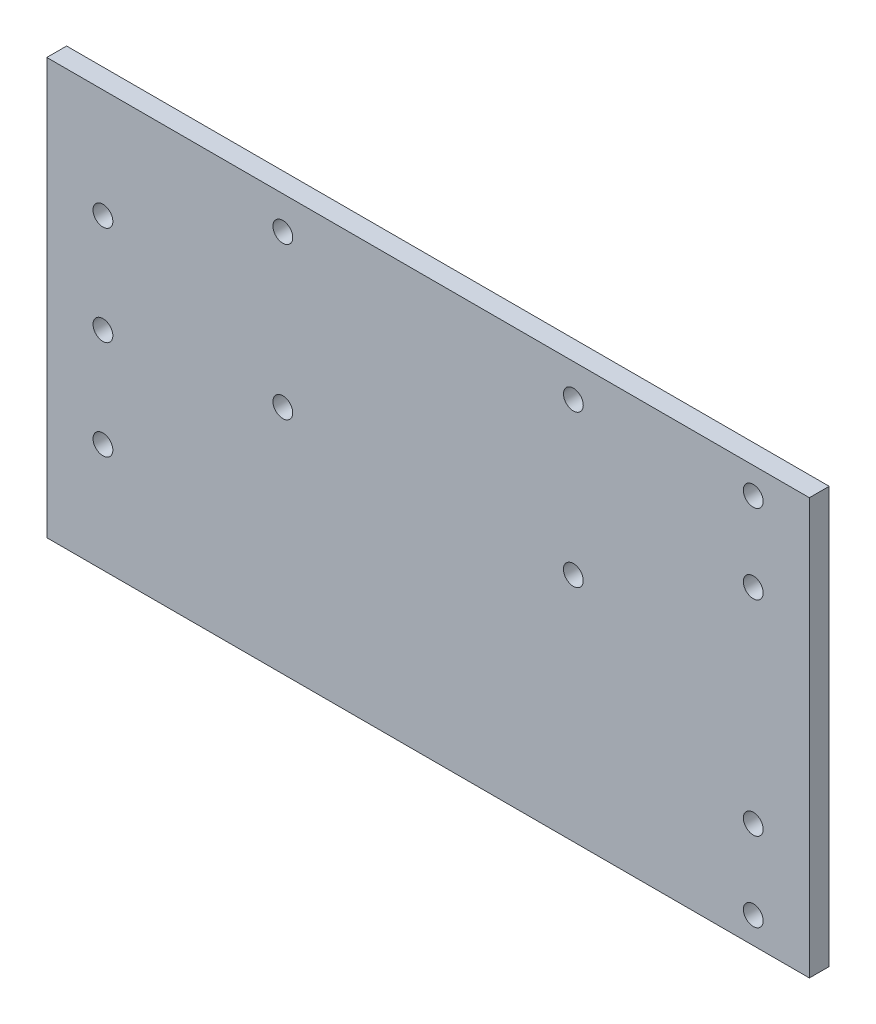
ISO-10303-21;
HEADER;
FILE_DESCRIPTION(('STEP AP214'),'2;1');
FILE_NAME('part.step','',(''),(''),'','','');
FILE_SCHEMA(('AUTOMOTIVE_DESIGN { 1 0 10303 214 1 1 1 1 }'));
ENDSEC;
DATA;
#1=APPLICATION_CONTEXT('core data for automotive mechanical design processes');
#2=APPLICATION_PROTOCOL_DEFINITION('international standard','automotive_design',2000,#1);
#3=PRODUCT_CONTEXT('',#1,'mechanical');
#4=PRODUCT('Part','Part','',(#3));
#5=PRODUCT_RELATED_PRODUCT_CATEGORY('part','',(#4));
#6=PRODUCT_DEFINITION_FORMATION('','',#4);
#7=PRODUCT_DEFINITION_CONTEXT('part definition',#1,'design');
#8=PRODUCT_DEFINITION('design','',#6,#7);
#9=PRODUCT_DEFINITION_SHAPE('','',#8);
#10=(LENGTH_UNIT() NAMED_UNIT(*) SI_UNIT(.MILLI.,.METRE.));
#11=(NAMED_UNIT(*) PLANE_ANGLE_UNIT() SI_UNIT($,.RADIAN.));
#12=(NAMED_UNIT(*) SI_UNIT($,.STERADIAN.) SOLID_ANGLE_UNIT());
#13=UNCERTAINTY_MEASURE_WITH_UNIT(LENGTH_MEASURE(1.E-05),#10,'distance_accuracy_value','');
#14=(GEOMETRIC_REPRESENTATION_CONTEXT(3) GLOBAL_UNCERTAINTY_ASSIGNED_CONTEXT((#13)) GLOBAL_UNIT_ASSIGNED_CONTEXT((#10,
#11,#12)) REPRESENTATION_CONTEXT('',''));
#15=CARTESIAN_POINT('',(0.,0.,0.));
#16=DIRECTION('',(0.,0.,1.));
#17=DIRECTION('',(1.,0.,0.));
#18=AXIS2_PLACEMENT_3D('',#15,#16,#17);
#19=CARTESIAN_POINT('',(57.75,31.5,3.));
#20=DIRECTION('',(-1.,0.,0.));
#21=DIRECTION('',(0.,-1.,0.));
#22=AXIS2_PLACEMENT_3D('',#19,#20,#21);
#23=PLANE('',#22);
#24=DIRECTION('',(0.,1.,0.));
#25=VECTOR('',#24,1.);
#26=CARTESIAN_POINT('',(57.75,31.5,0.));
#27=LINE('',#26,#25);
#28=CARTESIAN_POINT('',(57.75,-31.5,0.));
#29=VERTEX_POINT('',#28);
#30=CARTESIAN_POINT('',(57.75,31.5,0.));
#31=VERTEX_POINT('',#30);
#32=EDGE_CURVE('E107',#29,#31,#27,.T.);
#33=ORIENTED_EDGE('',*,*,#32,.T.);
#34=DIRECTION('',(0.,0.,-1.));
#35=VECTOR('',#34,1.);
#36=CARTESIAN_POINT('',(57.75,31.5,3.));
#37=LINE('',#36,#35);
#38=CARTESIAN_POINT('',(57.75,31.5,3.));
#39=VERTEX_POINT('',#38);
#40=EDGE_CURVE('E11',#39,#31,#37,.T.);
#41=ORIENTED_EDGE('',*,*,#40,.F.);
#42=DIRECTION('',(0.,1.,0.));
#43=VECTOR('',#42,1.);
#44=CARTESIAN_POINT('',(57.75,31.5,3.));
#45=LINE('',#44,#43);
#46=CARTESIAN_POINT('',(57.75,-31.5,3.));
#47=VERTEX_POINT('',#46);
#48=EDGE_CURVE('E91',#47,#39,#45,.T.);
#49=ORIENTED_EDGE('',*,*,#48,.F.);
#50=DIRECTION('',(0.,0.,-1.));
#51=VECTOR('',#50,1.);
#52=CARTESIAN_POINT('',(57.75,-31.5,3.));
#53=LINE('',#52,#51);
#54=EDGE_CURVE('E103',#47,#29,#53,.T.);
#55=ORIENTED_EDGE('',*,*,#54,.T.);
#56=EDGE_LOOP('',(#33,#41,#49,#55));
#57=FACE_BOUND('',#56,.T.);
#58=ADVANCED_FACE('F39',(#57),#23,.F.);
#59=CARTESIAN_POINT('',(-57.75,31.5,3.));
#60=DIRECTION('',(0.,-1.,0.));
#61=DIRECTION('',(0.,0.,-1.));
#62=AXIS2_PLACEMENT_3D('',#59,#60,#61);
#63=PLANE('',#62);
#64=DIRECTION('',(-1.,0.,0.));
#65=VECTOR('',#64,1.);
#66=CARTESIAN_POINT('',(-57.75,31.5,0.));
#67=LINE('',#66,#65);
#68=CARTESIAN_POINT('',(-57.75,31.5,0.));
#69=VERTEX_POINT('',#68);
#70=EDGE_CURVE('E96',#31,#69,#67,.T.);
#71=ORIENTED_EDGE('',*,*,#70,.T.);
#72=DIRECTION('',(0.,0.,-1.));
#73=VECTOR('',#72,1.);
#74=CARTESIAN_POINT('',(-57.75,31.5,3.));
#75=LINE('',#74,#73);
#76=CARTESIAN_POINT('',(-57.75,31.5,3.));
#77=VERTEX_POINT('',#76);
#78=EDGE_CURVE('E48',#77,#69,#75,.T.);
#79=ORIENTED_EDGE('',*,*,#78,.F.);
#80=DIRECTION('',(-1.,0.,0.));
#81=VECTOR('',#80,1.);
#82=CARTESIAN_POINT('',(-57.75,31.5,3.));
#83=LINE('',#82,#81);
#84=EDGE_CURVE('E86',#39,#77,#83,.T.);
#85=ORIENTED_EDGE('',*,*,#84,.F.);
#86=ORIENTED_EDGE('',*,*,#40,.T.);
#87=EDGE_LOOP('',(#71,#79,#85,#86));
#88=FACE_BOUND('',#87,.T.);
#89=ADVANCED_FACE('F95',(#88),#63,.F.);
#90=CARTESIAN_POINT('',(-57.75,31.5,3.));
#91=DIRECTION('',(1.,0.,0.));
#92=DIRECTION('',(0.,1.,0.));
#93=AXIS2_PLACEMENT_3D('',#90,#91,#92);
#94=PLANE('',#93);
#95=DIRECTION('',(0.,-1.,0.));
#96=VECTOR('',#95,1.);
#97=CARTESIAN_POINT('',(-57.75,31.5,0.));
#98=LINE('',#97,#96);
#99=CARTESIAN_POINT('',(-57.75,-31.5,0.));
#100=VERTEX_POINT('',#99);
#101=EDGE_CURVE('E73',#69,#100,#98,.T.);
#102=ORIENTED_EDGE('',*,*,#101,.T.);
#103=DIRECTION('',(0.,0.,-1.));
#104=VECTOR('',#103,1.);
#105=CARTESIAN_POINT('',(-57.75,-31.5,3.));
#106=LINE('',#105,#104);
#107=CARTESIAN_POINT('',(-57.75,-31.5,3.));
#108=VERTEX_POINT('',#107);
#109=EDGE_CURVE('E98',#108,#100,#106,.T.);
#110=ORIENTED_EDGE('',*,*,#109,.F.);
#111=DIRECTION('',(0.,-1.,0.));
#112=VECTOR('',#111,1.);
#113=CARTESIAN_POINT('',(-57.75,31.5,3.));
#114=LINE('',#113,#112);
#115=EDGE_CURVE('E89',#77,#108,#114,.T.);
#116=ORIENTED_EDGE('',*,*,#115,.F.);
#117=ORIENTED_EDGE('',*,*,#78,.T.);
#118=EDGE_LOOP('',(#102,#110,#116,#117));
#119=FACE_BOUND('',#118,.T.);
#120=ADVANCED_FACE('F99',(#119),#94,.F.);
#121=CARTESIAN_POINT('',(-57.75,-31.5,3.));
#122=DIRECTION('',(0.,1.,0.));
#123=DIRECTION('',(0.,0.,1.));
#124=AXIS2_PLACEMENT_3D('',#121,#122,#123);
#125=PLANE('',#124);
#126=DIRECTION('',(1.,0.,0.));
#127=VECTOR('',#126,1.);
#128=CARTESIAN_POINT('',(-57.75,-31.5,0.));
#129=LINE('',#128,#127);
#130=EDGE_CURVE('E79',#100,#29,#129,.T.);
#131=ORIENTED_EDGE('',*,*,#130,.T.);
#132=ORIENTED_EDGE('',*,*,#54,.F.);
#133=DIRECTION('',(1.,0.,0.));
#134=VECTOR('',#133,1.);
#135=CARTESIAN_POINT('',(-57.75,-31.5,3.));
#136=LINE('',#135,#134);
#137=EDGE_CURVE('E56',#108,#47,#136,.T.);
#138=ORIENTED_EDGE('',*,*,#137,.F.);
#139=ORIENTED_EDGE('',*,*,#109,.T.);
#140=EDGE_LOOP('',(#131,#132,#138,#139));
#141=FACE_BOUND('',#140,.T.);
#142=ADVANCED_FACE('F121',(#141),#125,.F.);
#143=CARTESIAN_POINT('',(0.,0.,3.));
#144=DIRECTION('',(0.,0.,1.));
#145=DIRECTION('',(1.,0.,0.));
#146=AXIS2_PLACEMENT_3D('',#143,#144,#145);
#147=PLANE('',#146);
#148=CARTESIAN_POINT('',(-22.,3.5,3.));
#149=DIRECTION('',(0.,0.,1.));
#150=DIRECTION('',(1.,0.,0.));
#151=AXIS2_PLACEMENT_3D('',#148,#149,#150);
#152=CIRCLE('',#151,1.5);
#153=CARTESIAN_POINT('',(-20.5,3.5,3.));
#154=VERTEX_POINT('',#153);
#155=EDGE_CURVE('E192',#154,#154,#152,.T.);
#156=ORIENTED_EDGE('',*,*,#155,.F.);
#157=EDGE_LOOP('',(#156));
#158=FACE_BOUND('',#157,.T.);
#159=CARTESIAN_POINT('',(22.,3.5,3.));
#160=DIRECTION('',(0.,0.,1.));
#161=DIRECTION('',(1.,0.,0.));
#162=AXIS2_PLACEMENT_3D('',#159,#160,#161);
#163=CIRCLE('',#162,1.5);
#164=CARTESIAN_POINT('',(23.5,3.5,3.));
#165=VERTEX_POINT('',#164);
#166=EDGE_CURVE('E200',#165,#165,#163,.T.);
#167=ORIENTED_EDGE('',*,*,#166,.F.);
#168=EDGE_LOOP('',(#167));
#169=FACE_BOUND('',#168,.T.);
#170=CARTESIAN_POINT('',(22.,26.5,3.));
#171=DIRECTION('',(0.,0.,1.));
#172=DIRECTION('',(1.,0.,0.));
#173=AXIS2_PLACEMENT_3D('',#170,#171,#172);
#174=CIRCLE('',#173,1.5);
#175=CARTESIAN_POINT('',(23.5,26.5,3.));
#176=VERTEX_POINT('',#175);
#177=EDGE_CURVE('E208',#176,#176,#174,.T.);
#178=ORIENTED_EDGE('',*,*,#177,.F.);
#179=EDGE_LOOP('',(#178));
#180=FACE_BOUND('',#179,.T.);
#181=CARTESIAN_POINT('',(-22.,26.5,3.));
#182=DIRECTION('',(0.,0.,1.));
#183=DIRECTION('',(1.,0.,0.));
#184=AXIS2_PLACEMENT_3D('',#181,#182,#183);
#185=CIRCLE('',#184,1.5);
#186=CARTESIAN_POINT('',(-20.5,26.5,3.));
#187=VERTEX_POINT('',#186);
#188=EDGE_CURVE('E184',#187,#187,#185,.T.);
#189=ORIENTED_EDGE('',*,*,#188,.F.);
#190=EDGE_LOOP('',(#189));
#191=FACE_BOUND('',#190,.T.);
#192=CARTESIAN_POINT('',(49.25,27.5,3.));
#193=DIRECTION('',(0.,0.,1.));
#194=DIRECTION('',(1.,0.,0.));
#195=AXIS2_PLACEMENT_3D('',#192,#193,#194);
#196=CIRCLE('',#195,1.5);
#197=CARTESIAN_POINT('',(50.75,27.5,3.));
#198=VERTEX_POINT('',#197);
#199=EDGE_CURVE('E145',#198,#198,#196,.T.);
#200=ORIENTED_EDGE('',*,*,#199,.F.);
#201=EDGE_LOOP('',(#200));
#202=FACE_BOUND('',#201,.T.);
#203=CARTESIAN_POINT('',(-49.25,-15.,3.));
#204=DIRECTION('',(0.,0.,1.));
#205=DIRECTION('',(1.,0.,0.));
#206=AXIS2_PLACEMENT_3D('',#203,#204,#205);
#207=CIRCLE('',#206,1.5);
#208=CARTESIAN_POINT('',(-47.75,-15.,3.));
#209=VERTEX_POINT('',#208);
#210=EDGE_CURVE('E162',#209,#209,#207,.T.);
#211=ORIENTED_EDGE('',*,*,#210,.F.);
#212=EDGE_LOOP('',(#211));
#213=FACE_BOUND('',#212,.T.);
#214=CARTESIAN_POINT('',(-49.25,15.,3.));
#215=DIRECTION('',(0.,0.,1.));
#216=DIRECTION('',(1.,0.,0.));
#217=AXIS2_PLACEMENT_3D('',#214,#215,#216);
#218=CIRCLE('',#217,1.5);
#219=CARTESIAN_POINT('',(-47.75,15.,3.));
#220=VERTEX_POINT('',#219);
#221=EDGE_CURVE('E171',#220,#220,#218,.T.);
#222=ORIENTED_EDGE('',*,*,#221,.F.);
#223=EDGE_LOOP('',(#222));
#224=FACE_BOUND('',#223,.T.);
#225=CARTESIAN_POINT('',(49.25,-27.5,3.));
#226=DIRECTION('',(0.,0.,1.));
#227=DIRECTION('',(1.,0.,0.));
#228=AXIS2_PLACEMENT_3D('',#225,#226,#227);
#229=CIRCLE('',#228,1.5);
#230=CARTESIAN_POINT('',(50.75,-27.5,3.));
#231=VERTEX_POINT('',#230);
#232=EDGE_CURVE('E137',#231,#231,#229,.T.);
#233=ORIENTED_EDGE('',*,*,#232,.F.);
#234=EDGE_LOOP('',(#233));
#235=FACE_BOUND('',#234,.T.);
#236=CARTESIAN_POINT('',(-49.25,0.,3.));
#237=DIRECTION('',(0.,0.,1.));
#238=DIRECTION('',(1.,0.,0.));
#239=AXIS2_PLACEMENT_3D('',#236,#237,#238);
#240=CIRCLE('',#239,1.5);
#241=CARTESIAN_POINT('',(-47.75,0.,3.));
#242=VERTEX_POINT('',#241);
#243=EDGE_CURVE('E128',#242,#242,#240,.T.);
#244=ORIENTED_EDGE('',*,*,#243,.F.);
#245=EDGE_LOOP('',(#244));
#246=FACE_BOUND('',#245,.T.);
#247=CARTESIAN_POINT('',(49.25,15.5,3.));
#248=DIRECTION('',(0.,0.,1.));
#249=DIRECTION('',(1.,0.,0.));
#250=AXIS2_PLACEMENT_3D('',#247,#248,#249);
#251=CIRCLE('',#250,1.5);
#252=CARTESIAN_POINT('',(50.75,15.5,3.));
#253=VERTEX_POINT('',#252);
#254=EDGE_CURVE('E155',#253,#253,#251,.T.);
#255=ORIENTED_EDGE('',*,*,#254,.F.);
#256=EDGE_LOOP('',(#255));
#257=FACE_BOUND('',#256,.T.);
#258=CARTESIAN_POINT('',(49.25,-15.5,3.));
#259=DIRECTION('',(0.,0.,1.));
#260=DIRECTION('',(1.,0.,0.));
#261=AXIS2_PLACEMENT_3D('',#258,#259,#260);
#262=CIRCLE('',#261,1.5);
#263=CARTESIAN_POINT('',(50.75,-15.5,3.));
#264=VERTEX_POINT('',#263);
#265=EDGE_CURVE('E146',#264,#264,#262,.T.);
#266=ORIENTED_EDGE('',*,*,#265,.F.);
#267=EDGE_LOOP('',(#266));
#268=FACE_BOUND('',#267,.T.);
#269=ORIENTED_EDGE('',*,*,#48,.T.);
#270=ORIENTED_EDGE('',*,*,#84,.T.);
#271=ORIENTED_EDGE('',*,*,#115,.T.);
#272=ORIENTED_EDGE('',*,*,#137,.T.);
#273=EDGE_LOOP('',(#269,#270,#271,#272));
#274=FACE_BOUND('',#273,.T.);
#275=ADVANCED_FACE('F87',(#158,#169,#180,#191,#202,#213,#224,#235,#246,#257,#268,#274),#147,.T.);
#276=CARTESIAN_POINT('',(0.,0.,0.));
#277=DIRECTION('',(0.,0.,1.));
#278=DIRECTION('',(1.,0.,0.));
#279=AXIS2_PLACEMENT_3D('',#276,#277,#278);
#280=PLANE('',#279);
#281=CARTESIAN_POINT('',(-22.,3.5,0.));
#282=DIRECTION('',(0.,0.,1.));
#283=DIRECTION('',(1.,0.,0.));
#284=AXIS2_PLACEMENT_3D('',#281,#282,#283);
#285=CIRCLE('',#284,1.5);
#286=CARTESIAN_POINT('',(-20.5,3.5,0.));
#287=VERTEX_POINT('',#286);
#288=EDGE_CURVE('E196',#287,#287,#285,.T.);
#289=ORIENTED_EDGE('',*,*,#288,.T.);
#290=EDGE_LOOP('',(#289));
#291=FACE_BOUND('',#290,.T.);
#292=CARTESIAN_POINT('',(22.,3.5,0.));
#293=DIRECTION('',(0.,0.,1.));
#294=DIRECTION('',(1.,0.,0.));
#295=AXIS2_PLACEMENT_3D('',#292,#293,#294);
#296=CIRCLE('',#295,1.5);
#297=CARTESIAN_POINT('',(23.5,3.5,0.));
#298=VERTEX_POINT('',#297);
#299=EDGE_CURVE('E204',#298,#298,#296,.T.);
#300=ORIENTED_EDGE('',*,*,#299,.T.);
#301=EDGE_LOOP('',(#300));
#302=FACE_BOUND('',#301,.T.);
#303=CARTESIAN_POINT('',(22.,26.5,0.));
#304=DIRECTION('',(0.,0.,1.));
#305=DIRECTION('',(1.,0.,0.));
#306=AXIS2_PLACEMENT_3D('',#303,#304,#305);
#307=CIRCLE('',#306,1.5);
#308=CARTESIAN_POINT('',(23.5,26.5,0.));
#309=VERTEX_POINT('',#308);
#310=EDGE_CURVE('E188',#309,#309,#307,.T.);
#311=ORIENTED_EDGE('',*,*,#310,.T.);
#312=EDGE_LOOP('',(#311));
#313=FACE_BOUND('',#312,.T.);
#314=CARTESIAN_POINT('',(-22.,26.5,0.));
#315=DIRECTION('',(0.,0.,1.));
#316=DIRECTION('',(1.,0.,0.));
#317=AXIS2_PLACEMENT_3D('',#314,#315,#316);
#318=CIRCLE('',#317,1.5);
#319=CARTESIAN_POINT('',(-20.5,26.5,0.));
#320=VERTEX_POINT('',#319);
#321=EDGE_CURVE('E167',#320,#320,#318,.T.);
#322=ORIENTED_EDGE('',*,*,#321,.T.);
#323=EDGE_LOOP('',(#322));
#324=FACE_BOUND('',#323,.T.);
#325=CARTESIAN_POINT('',(49.25,27.5,0.));
#326=DIRECTION('',(0.,0.,1.));
#327=DIRECTION('',(1.,0.,0.));
#328=AXIS2_PLACEMENT_3D('',#325,#326,#327);
#329=CIRCLE('',#328,1.5);
#330=CARTESIAN_POINT('',(50.75,27.5,0.));
#331=VERTEX_POINT('',#330);
#332=EDGE_CURVE('E111',#331,#331,#329,.T.);
#333=ORIENTED_EDGE('',*,*,#332,.T.);
#334=EDGE_LOOP('',(#333));
#335=FACE_BOUND('',#334,.T.);
#336=CARTESIAN_POINT('',(-49.25,-15.,0.));
#337=DIRECTION('',(0.,0.,1.));
#338=DIRECTION('',(1.,0.,0.));
#339=AXIS2_PLACEMENT_3D('',#336,#337,#338);
#340=CIRCLE('',#339,1.5);
#341=CARTESIAN_POINT('',(-47.75,-15.,0.));
#342=VERTEX_POINT('',#341);
#343=EDGE_CURVE('E166',#342,#342,#340,.T.);
#344=ORIENTED_EDGE('',*,*,#343,.T.);
#345=EDGE_LOOP('',(#344));
#346=FACE_BOUND('',#345,.T.);
#347=CARTESIAN_POINT('',(-49.25,15.,0.));
#348=DIRECTION('',(0.,0.,1.));
#349=DIRECTION('',(1.,0.,0.));
#350=AXIS2_PLACEMENT_3D('',#347,#348,#349);
#351=CIRCLE('',#350,1.5);
#352=CARTESIAN_POINT('',(-47.75,15.,0.));
#353=VERTEX_POINT('',#352);
#354=EDGE_CURVE('E151',#353,#353,#351,.T.);
#355=ORIENTED_EDGE('',*,*,#354,.T.);
#356=EDGE_LOOP('',(#355));
#357=FACE_BOUND('',#356,.T.);
#358=CARTESIAN_POINT('',(49.25,-27.5,0.));
#359=DIRECTION('',(0.,0.,1.));
#360=DIRECTION('',(1.,0.,0.));
#361=AXIS2_PLACEMENT_3D('',#358,#359,#360);
#362=CIRCLE('',#361,1.5);
#363=CARTESIAN_POINT('',(50.75,-27.5,0.));
#364=VERTEX_POINT('',#363);
#365=EDGE_CURVE('E141',#364,#364,#362,.T.);
#366=ORIENTED_EDGE('',*,*,#365,.T.);
#367=EDGE_LOOP('',(#366));
#368=FACE_BOUND('',#367,.T.);
#369=CARTESIAN_POINT('',(-49.25,0.,0.));
#370=DIRECTION('',(0.,0.,1.));
#371=DIRECTION('',(1.,0.,0.));
#372=AXIS2_PLACEMENT_3D('',#369,#370,#371);
#373=CIRCLE('',#372,1.5);
#374=CARTESIAN_POINT('',(-47.75,0.,0.));
#375=VERTEX_POINT('',#374);
#376=EDGE_CURVE('E132',#375,#375,#373,.T.);
#377=ORIENTED_EDGE('',*,*,#376,.T.);
#378=EDGE_LOOP('',(#377));
#379=FACE_BOUND('',#378,.T.);
#380=CARTESIAN_POINT('',(49.25,15.5,0.));
#381=DIRECTION('',(0.,0.,1.));
#382=DIRECTION('',(1.,0.,0.));
#383=AXIS2_PLACEMENT_3D('',#380,#381,#382);
#384=CIRCLE('',#383,1.5);
#385=CARTESIAN_POINT('',(50.75,15.5,0.));
#386=VERTEX_POINT('',#385);
#387=EDGE_CURVE('E133',#386,#386,#384,.T.);
#388=ORIENTED_EDGE('',*,*,#387,.T.);
#389=EDGE_LOOP('',(#388));
#390=FACE_BOUND('',#389,.T.);
#391=CARTESIAN_POINT('',(49.25,-15.5,0.));
#392=DIRECTION('',(0.,0.,1.));
#393=DIRECTION('',(1.,0.,0.));
#394=AXIS2_PLACEMENT_3D('',#391,#392,#393);
#395=CIRCLE('',#394,1.5);
#396=CARTESIAN_POINT('',(50.75,-15.5,0.));
#397=VERTEX_POINT('',#396);
#398=EDGE_CURVE('E150',#397,#397,#395,.T.);
#399=ORIENTED_EDGE('',*,*,#398,.T.);
#400=EDGE_LOOP('',(#399));
#401=FACE_BOUND('',#400,.T.);
#402=ORIENTED_EDGE('',*,*,#32,.F.);
#403=ORIENTED_EDGE('',*,*,#130,.F.);
#404=ORIENTED_EDGE('',*,*,#101,.F.);
#405=ORIENTED_EDGE('',*,*,#70,.F.);
#406=EDGE_LOOP('',(#402,#403,#404,#405));
#407=FACE_BOUND('',#406,.T.);
#408=ADVANCED_FACE('F124',(#291,#302,#313,#324,#335,#346,#357,#368,#379,#390,#401,#407),#280,.F.);
#409=CARTESIAN_POINT('',(49.25,-15.5,0.));
#410=DIRECTION('',(0.,0.,1.));
#411=DIRECTION('',(1.,0.,0.));
#412=AXIS2_PLACEMENT_3D('',#409,#410,#411);
#413=CYLINDRICAL_SURFACE('',#412,1.5);
#414=ORIENTED_EDGE('',*,*,#398,.F.);
#415=EDGE_LOOP('',(#414));
#416=FACE_BOUND('',#415,.T.);
#417=ORIENTED_EDGE('',*,*,#265,.T.);
#418=EDGE_LOOP('',(#417));
#419=FACE_BOUND('',#418,.T.);
#420=ADVANCED_FACE('F246',(#416,#419),#413,.F.);
#421=CARTESIAN_POINT('',(49.25,15.5,0.));
#422=DIRECTION('',(0.,0.,1.));
#423=DIRECTION('',(1.,0.,0.));
#424=AXIS2_PLACEMENT_3D('',#421,#422,#423);
#425=CYLINDRICAL_SURFACE('',#424,1.5);
#426=ORIENTED_EDGE('',*,*,#387,.F.);
#427=EDGE_LOOP('',(#426));
#428=FACE_BOUND('',#427,.T.);
#429=ORIENTED_EDGE('',*,*,#254,.T.);
#430=EDGE_LOOP('',(#429));
#431=FACE_BOUND('',#430,.T.);
#432=ADVANCED_FACE('F248',(#428,#431),#425,.F.);
#433=CARTESIAN_POINT('',(-49.25,0.,0.));
#434=DIRECTION('',(0.,0.,1.));
#435=DIRECTION('',(1.,0.,0.));
#436=AXIS2_PLACEMENT_3D('',#433,#434,#435);
#437=CYLINDRICAL_SURFACE('',#436,1.5);
#438=ORIENTED_EDGE('',*,*,#376,.F.);
#439=EDGE_LOOP('',(#438));
#440=FACE_BOUND('',#439,.T.);
#441=ORIENTED_EDGE('',*,*,#243,.T.);
#442=EDGE_LOOP('',(#441));
#443=FACE_BOUND('',#442,.T.);
#444=ADVANCED_FACE('F255',(#440,#443),#437,.F.);
#445=CARTESIAN_POINT('',(49.25,-27.5,0.));
#446=DIRECTION('',(0.,0.,1.));
#447=DIRECTION('',(1.,0.,0.));
#448=AXIS2_PLACEMENT_3D('',#445,#446,#447);
#449=CYLINDRICAL_SURFACE('',#448,1.5);
#450=ORIENTED_EDGE('',*,*,#365,.F.);
#451=EDGE_LOOP('',(#450));
#452=FACE_BOUND('',#451,.T.);
#453=ORIENTED_EDGE('',*,*,#232,.T.);
#454=EDGE_LOOP('',(#453));
#455=FACE_BOUND('',#454,.T.);
#456=ADVANCED_FACE('F274',(#452,#455),#449,.F.);
#457=CARTESIAN_POINT('',(-49.25,15.,0.));
#458=DIRECTION('',(0.,0.,1.));
#459=DIRECTION('',(1.,0.,0.));
#460=AXIS2_PLACEMENT_3D('',#457,#458,#459);
#461=CYLINDRICAL_SURFACE('',#460,1.5);
#462=ORIENTED_EDGE('',*,*,#354,.F.);
#463=EDGE_LOOP('',(#462));
#464=FACE_BOUND('',#463,.T.);
#465=ORIENTED_EDGE('',*,*,#221,.T.);
#466=EDGE_LOOP('',(#465));
#467=FACE_BOUND('',#466,.T.);
#468=ADVANCED_FACE('F277',(#464,#467),#461,.F.);
#469=CARTESIAN_POINT('',(-49.25,-15.,0.));
#470=DIRECTION('',(0.,0.,1.));
#471=DIRECTION('',(1.,0.,0.));
#472=AXIS2_PLACEMENT_3D('',#469,#470,#471);
#473=CYLINDRICAL_SURFACE('',#472,1.5);
#474=ORIENTED_EDGE('',*,*,#343,.F.);
#475=EDGE_LOOP('',(#474));
#476=FACE_BOUND('',#475,.T.);
#477=ORIENTED_EDGE('',*,*,#210,.T.);
#478=EDGE_LOOP('',(#477));
#479=FACE_BOUND('',#478,.T.);
#480=ADVANCED_FACE('F282',(#476,#479),#473,.F.);
#481=CARTESIAN_POINT('',(49.25,27.5,0.));
#482=DIRECTION('',(0.,0.,1.));
#483=DIRECTION('',(1.,0.,0.));
#484=AXIS2_PLACEMENT_3D('',#481,#482,#483);
#485=CYLINDRICAL_SURFACE('',#484,1.5);
#486=ORIENTED_EDGE('',*,*,#332,.F.);
#487=EDGE_LOOP('',(#486));
#488=FACE_BOUND('',#487,.T.);
#489=ORIENTED_EDGE('',*,*,#199,.T.);
#490=EDGE_LOOP('',(#489));
#491=FACE_BOUND('',#490,.T.);
#492=ADVANCED_FACE('F298',(#488,#491),#485,.F.);
#493=CARTESIAN_POINT('',(-22.,26.5,0.));
#494=DIRECTION('',(0.,0.,1.));
#495=DIRECTION('',(1.,0.,0.));
#496=AXIS2_PLACEMENT_3D('',#493,#494,#495);
#497=CYLINDRICAL_SURFACE('',#496,1.5);
#498=ORIENTED_EDGE('',*,*,#321,.F.);
#499=EDGE_LOOP('',(#498));
#500=FACE_BOUND('',#499,.T.);
#501=ORIENTED_EDGE('',*,*,#188,.T.);
#502=EDGE_LOOP('',(#501));
#503=FACE_BOUND('',#502,.T.);
#504=ADVANCED_FACE('F222',(#500,#503),#497,.F.);
#505=CARTESIAN_POINT('',(22.,26.5,0.));
#506=DIRECTION('',(0.,0.,1.));
#507=DIRECTION('',(1.,0.,0.));
#508=AXIS2_PLACEMENT_3D('',#505,#506,#507);
#509=CYLINDRICAL_SURFACE('',#508,1.5);
#510=ORIENTED_EDGE('',*,*,#310,.F.);
#511=EDGE_LOOP('',(#510));
#512=FACE_BOUND('',#511,.T.);
#513=ORIENTED_EDGE('',*,*,#177,.T.);
#514=EDGE_LOOP('',(#513));
#515=FACE_BOUND('',#514,.T.);
#516=ADVANCED_FACE('F218',(#512,#515),#509,.F.);
#517=CARTESIAN_POINT('',(22.,3.5,0.));
#518=DIRECTION('',(0.,0.,1.));
#519=DIRECTION('',(1.,0.,0.));
#520=AXIS2_PLACEMENT_3D('',#517,#518,#519);
#521=CYLINDRICAL_SURFACE('',#520,1.5);
#522=ORIENTED_EDGE('',*,*,#299,.F.);
#523=EDGE_LOOP('',(#522));
#524=FACE_BOUND('',#523,.T.);
#525=ORIENTED_EDGE('',*,*,#166,.T.);
#526=EDGE_LOOP('',(#525));
#527=FACE_BOUND('',#526,.T.);
#528=ADVANCED_FACE('F221',(#524,#527),#521,.F.);
#529=CARTESIAN_POINT('',(-22.,3.5,0.));
#530=DIRECTION('',(0.,0.,1.));
#531=DIRECTION('',(1.,0.,0.));
#532=AXIS2_PLACEMENT_3D('',#529,#530,#531);
#533=CYLINDRICAL_SURFACE('',#532,1.5);
#534=ORIENTED_EDGE('',*,*,#288,.F.);
#535=EDGE_LOOP('',(#534));
#536=FACE_BOUND('',#535,.T.);
#537=ORIENTED_EDGE('',*,*,#155,.T.);
#538=EDGE_LOOP('',(#537));
#539=FACE_BOUND('',#538,.T.);
#540=ADVANCED_FACE('F310',(#536,#539),#533,.F.);
#541=CLOSED_SHELL('',(#58,#89,#120,#142,#275,#408,#420,#432,#444,#456,#468,#480,#492,#504,#516,
#528,#540));
#542=MANIFOLD_SOLID_BREP('B2',#541);
#543=ADVANCED_BREP_SHAPE_REPRESENTATION('',(#18,#542),#14);
#544=SHAPE_DEFINITION_REPRESENTATION(#9,#543);
ENDSEC;
END-ISO-10303-21;
